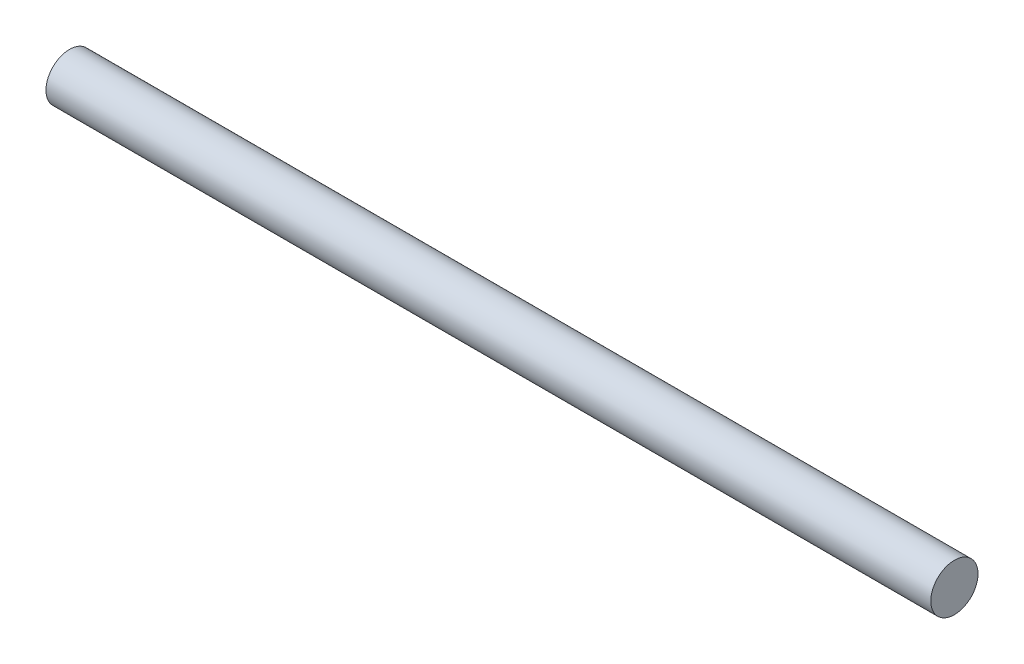
ISO-10303-21;
HEADER;
FILE_DESCRIPTION(('STEP AP214'),'2;1');
FILE_NAME('part.step','',(''),(''),'','','');
FILE_SCHEMA(('AUTOMOTIVE_DESIGN { 1 0 10303 214 1 1 1 1 }'));
ENDSEC;
DATA;
#1=APPLICATION_CONTEXT('core data for automotive mechanical design processes');
#2=APPLICATION_PROTOCOL_DEFINITION('international standard','automotive_design',2000,#1);
#3=PRODUCT_CONTEXT('',#1,'mechanical');
#4=PRODUCT('Part','Part','',(#3));
#5=PRODUCT_RELATED_PRODUCT_CATEGORY('part','',(#4));
#6=PRODUCT_DEFINITION_FORMATION('','',#4);
#7=PRODUCT_DEFINITION_CONTEXT('part definition',#1,'design');
#8=PRODUCT_DEFINITION('design','',#6,#7);
#9=PRODUCT_DEFINITION_SHAPE('','',#8);
#10=(LENGTH_UNIT() NAMED_UNIT(*) SI_UNIT(.MILLI.,.METRE.));
#11=(NAMED_UNIT(*) PLANE_ANGLE_UNIT() SI_UNIT($,.RADIAN.));
#12=(NAMED_UNIT(*) SI_UNIT($,.STERADIAN.) SOLID_ANGLE_UNIT());
#13=UNCERTAINTY_MEASURE_WITH_UNIT(LENGTH_MEASURE(1.E-05),#10,'distance_accuracy_value','');
#14=(GEOMETRIC_REPRESENTATION_CONTEXT(3) GLOBAL_UNCERTAINTY_ASSIGNED_CONTEXT((#13)) GLOBAL_UNIT_ASSIGNED_CONTEXT((#10,
#11,#12)) REPRESENTATION_CONTEXT('',''));
#15=CARTESIAN_POINT('',(0.,0.,0.));
#16=DIRECTION('',(0.,0.,1.));
#17=DIRECTION('',(1.,0.,0.));
#18=AXIS2_PLACEMENT_3D('',#15,#16,#17);
#19=CARTESIAN_POINT('',(150.,0.,0.));
#20=DIRECTION('',(-1.,0.,0.));
#21=DIRECTION('',(0.,0.,1.));
#22=AXIS2_PLACEMENT_3D('',#19,#20,#21);
#23=CYLINDRICAL_SURFACE('',#22,4.);
#24=CARTESIAN_POINT('',(150.,0.,0.));
#25=DIRECTION('',(1.,0.,0.));
#26=DIRECTION('',(0.,0.,-1.));
#27=AXIS2_PLACEMENT_3D('',#24,#25,#26);
#28=CIRCLE('',#27,4.);
#29=CARTESIAN_POINT('',(150.,0.,-4.));
#30=VERTEX_POINT('',#29);
#31=EDGE_CURVE('E10',#30,#30,#28,.T.);
#32=ORIENTED_EDGE('',*,*,#31,.F.);
#33=EDGE_LOOP('',(#32));
#34=FACE_BOUND('',#33,.T.);
#35=CARTESIAN_POINT('',(0.,0.,0.));
#36=DIRECTION('',(1.,0.,0.));
#37=DIRECTION('',(0.,0.,-1.));
#38=AXIS2_PLACEMENT_3D('',#35,#36,#37);
#39=CIRCLE('',#38,4.);
#40=CARTESIAN_POINT('',(0.,0.,-4.));
#41=VERTEX_POINT('',#40);
#42=EDGE_CURVE('E40',#41,#41,#39,.T.);
#43=ORIENTED_EDGE('',*,*,#42,.T.);
#44=EDGE_LOOP('',(#43));
#45=FACE_BOUND('',#44,.T.);
#46=ADVANCED_FACE('F37',(#34,#45),#23,.T.);
#47=CARTESIAN_POINT('',(150.,0.,0.));
#48=DIRECTION('',(1.,0.,0.));
#49=DIRECTION('',(0.,0.,-1.));
#50=AXIS2_PLACEMENT_3D('',#47,#48,#49);
#51=PLANE('',#50);
#52=ORIENTED_EDGE('',*,*,#31,.T.);
#53=EDGE_LOOP('',(#52));
#54=FACE_BOUND('',#53,.T.);
#55=ADVANCED_FACE('F54',(#54),#51,.T.);
#56=CARTESIAN_POINT('',(0.,0.,0.));
#57=DIRECTION('',(1.,0.,0.));
#58=DIRECTION('',(0.,0.,-1.));
#59=AXIS2_PLACEMENT_3D('',#56,#57,#58);
#60=PLANE('',#59);
#61=ORIENTED_EDGE('',*,*,#42,.F.);
#62=EDGE_LOOP('',(#61));
#63=FACE_BOUND('',#62,.T.);
#64=ADVANCED_FACE('F52',(#63),#60,.F.);
#65=CLOSED_SHELL('',(#46,#55,#64));
#66=MANIFOLD_SOLID_BREP('B2',#65);
#67=ADVANCED_BREP_SHAPE_REPRESENTATION('',(#18,#66),#14);
#68=SHAPE_DEFINITION_REPRESENTATION(#9,#67);
ENDSEC;
END-ISO-10303-21;
